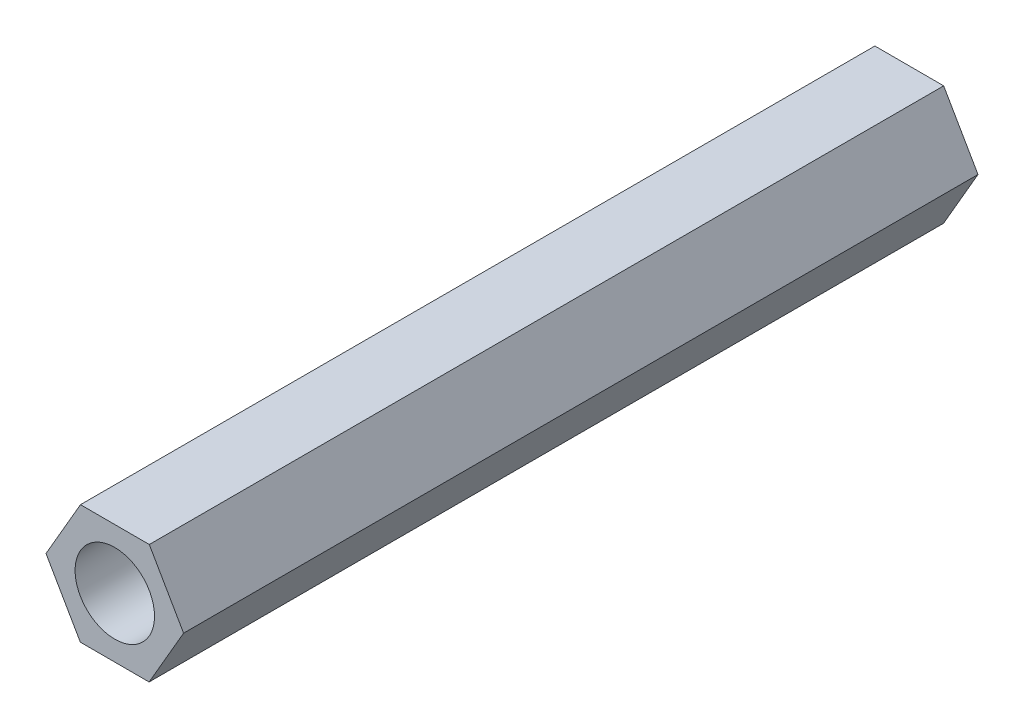
ISO-10303-21;
HEADER;
FILE_DESCRIPTION(('STEP AP214'),'2;1');
FILE_NAME('part.step','',(''),(''),'','','');
FILE_SCHEMA(('AUTOMOTIVE_DESIGN { 1 0 10303 214 1 1 1 1 }'));
ENDSEC;
DATA;
#1=APPLICATION_CONTEXT('core data for automotive mechanical design processes');
#2=APPLICATION_PROTOCOL_DEFINITION('international standard','automotive_design',2000,#1);
#3=PRODUCT_CONTEXT('',#1,'mechanical');
#4=PRODUCT('Part','Part','',(#3));
#5=PRODUCT_RELATED_PRODUCT_CATEGORY('part','',(#4));
#6=PRODUCT_DEFINITION_FORMATION('','',#4);
#7=PRODUCT_DEFINITION_CONTEXT('part definition',#1,'design');
#8=PRODUCT_DEFINITION('design','',#6,#7);
#9=PRODUCT_DEFINITION_SHAPE('','',#8);
#10=(LENGTH_UNIT() NAMED_UNIT(*) SI_UNIT(.MILLI.,.METRE.));
#11=(NAMED_UNIT(*) PLANE_ANGLE_UNIT() SI_UNIT($,.RADIAN.));
#12=(NAMED_UNIT(*) SI_UNIT($,.STERADIAN.) SOLID_ANGLE_UNIT());
#13=UNCERTAINTY_MEASURE_WITH_UNIT(LENGTH_MEASURE(1.E-05),#10,'distance_accuracy_value','');
#14=(GEOMETRIC_REPRESENTATION_CONTEXT(3) GLOBAL_UNCERTAINTY_ASSIGNED_CONTEXT((#13)) GLOBAL_UNIT_ASSIGNED_CONTEXT((#10,
#11,#12)) REPRESENTATION_CONTEXT('',''));
#15=CARTESIAN_POINT('',(0.,0.,0.));
#16=DIRECTION('',(0.,0.,1.));
#17=DIRECTION('',(1.,0.,0.));
#18=AXIS2_PLACEMENT_3D('',#15,#16,#17);
#19=CARTESIAN_POINT('',(2.60019629669739,1.49632189673249,40.));
#20=DIRECTION('',(-0.866732098899132,-0.498773965577499,0.));
#21=DIRECTION('',(0.498773965577499,-0.866732098899132,0.));
#22=AXIS2_PLACEMENT_3D('',#19,#20,#21);
#23=PLANE('',#22);
#24=DIRECTION('',(-0.498773965577499,0.866732098899132,0.));
#25=VECTOR('',#24,1.);
#26=CARTESIAN_POINT('',(2.60019629669739,1.49632189673249,0.));
#27=LINE('',#26,#25);
#28=CARTESIAN_POINT('',(3.46409814657022,-0.00490213511161112,0.));
#29=VERTEX_POINT('',#28);
#30=CARTESIAN_POINT('',(1.73629444682455,2.9975459285766,0.));
#31=VERTEX_POINT('',#30);
#32=EDGE_CURVE('E126',#29,#31,#27,.T.);
#33=ORIENTED_EDGE('',*,*,#32,.T.);
#34=DIRECTION('',(0.,0.,-1.));
#35=VECTOR('',#34,1.);
#36=CARTESIAN_POINT('',(1.73629444682455,2.9975459285766,40.));
#37=LINE('',#36,#35);
#38=CARTESIAN_POINT('',(1.73629444682455,2.9975459285766,40.));
#39=VERTEX_POINT('',#38);
#40=EDGE_CURVE('E11',#39,#31,#37,.T.);
#41=ORIENTED_EDGE('',*,*,#40,.F.);
#42=DIRECTION('',(-0.498773965577499,0.866732098899132,0.));
#43=VECTOR('',#42,1.);
#44=CARTESIAN_POINT('',(2.60019629669739,1.49632189673249,40.));
#45=LINE('',#44,#43);
#46=CARTESIAN_POINT('',(3.46409814657022,-0.00490213511161112,40.));
#47=VERTEX_POINT('',#46);
#48=EDGE_CURVE('E149',#47,#39,#45,.T.);
#49=ORIENTED_EDGE('',*,*,#48,.F.);
#50=DIRECTION('',(0.,0.,-1.));
#51=VECTOR('',#50,1.);
#52=CARTESIAN_POINT('',(3.46409814657022,-0.00490213511161112,40.));
#53=LINE('',#52,#51);
#54=EDGE_CURVE('E119',#47,#29,#53,.T.);
#55=ORIENTED_EDGE('',*,*,#54,.T.);
#56=EDGE_LOOP('',(#33,#41,#49,#55));
#57=FACE_BOUND('',#56,.T.);
#58=ADVANCED_FACE('F38',(#57),#23,.F.);
#59=CARTESIAN_POINT('',(0.00424537353943984,2.9999969961324,40.));
#60=DIRECTION('',(-0.00141512451314662,-0.999998998710805,0.));
#61=DIRECTION('',(0.999998998710805,-0.00141512451314662,0.));
#62=AXIS2_PLACEMENT_3D('',#59,#60,#61);
#63=PLANE('',#62);
#64=DIRECTION('',(-0.999998998710805,0.00141512451314662,0.));
#65=VECTOR('',#64,1.);
#66=CARTESIAN_POINT('',(0.00424537353943984,2.9999969961324,0.));
#67=LINE('',#66,#65);
#68=CARTESIAN_POINT('',(-1.72780369974567,3.00244806368821,0.));
#69=VERTEX_POINT('',#68);
#70=EDGE_CURVE('E129',#31,#69,#67,.T.);
#71=ORIENTED_EDGE('',*,*,#70,.T.);
#72=DIRECTION('',(0.,0.,-1.));
#73=VECTOR('',#72,1.);
#74=CARTESIAN_POINT('',(-1.72780369974567,3.00244806368821,40.));
#75=LINE('',#74,#73);
#76=CARTESIAN_POINT('',(-1.72780369974567,3.00244806368821,40.));
#77=VERTEX_POINT('',#76);
#78=EDGE_CURVE('E47',#77,#69,#75,.T.);
#79=ORIENTED_EDGE('',*,*,#78,.F.);
#80=DIRECTION('',(-0.999998998710805,0.00141512451314662,0.));
#81=VECTOR('',#80,1.);
#82=CARTESIAN_POINT('',(0.00424537353943984,2.9999969961324,40.));
#83=LINE('',#82,#81);
#84=EDGE_CURVE('E92',#39,#77,#83,.T.);
#85=ORIENTED_EDGE('',*,*,#84,.F.);
#86=ORIENTED_EDGE('',*,*,#40,.T.);
#87=EDGE_LOOP('',(#71,#79,#85,#86));
#88=FACE_BOUND('',#87,.T.);
#89=ADVANCED_FACE('F163',(#88),#63,.F.);
#90=CARTESIAN_POINT('',(-2.59595092315795,1.50367509939991,40.));
#91=DIRECTION('',(0.865316974385986,-0.501225033133305,0.));
#92=DIRECTION('',(0.501225033133305,0.865316974385986,0.));
#93=AXIS2_PLACEMENT_3D('',#90,#91,#92);
#94=PLANE('',#93);
#95=DIRECTION('',(-0.501225033133305,-0.865316974385986,0.));
#96=VECTOR('',#95,1.);
#97=CARTESIAN_POINT('',(-2.59595092315795,1.50367509939991,0.));
#98=LINE('',#97,#96);
#99=CARTESIAN_POINT('',(-3.46409814657022,0.00490213511161286,0.));
#100=VERTEX_POINT('',#99);
#101=EDGE_CURVE('E131',#69,#100,#98,.T.);
#102=ORIENTED_EDGE('',*,*,#101,.T.);
#103=DIRECTION('',(0.,0.,-1.));
#104=VECTOR('',#103,1.);
#105=CARTESIAN_POINT('',(-3.46409814657022,0.00490213511161286,40.));
#106=LINE('',#105,#104);
#107=CARTESIAN_POINT('',(-3.46409814657022,0.00490213511161286,40.));
#108=VERTEX_POINT('',#107);
#109=EDGE_CURVE('E114',#108,#100,#106,.T.);
#110=ORIENTED_EDGE('',*,*,#109,.F.);
#111=DIRECTION('',(-0.501225033133305,-0.865316974385986,0.));
#112=VECTOR('',#111,1.);
#113=CARTESIAN_POINT('',(-2.59595092315795,1.50367509939991,40.));
#114=LINE('',#113,#112);
#115=EDGE_CURVE('E105',#77,#108,#114,.T.);
#116=ORIENTED_EDGE('',*,*,#115,.F.);
#117=ORIENTED_EDGE('',*,*,#78,.T.);
#118=EDGE_LOOP('',(#102,#110,#116,#117));
#119=FACE_BOUND('',#118,.T.);
#120=ADVANCED_FACE('F142',(#119),#94,.F.);
#121=CARTESIAN_POINT('',(-2.60019629669739,-1.49632189673249,40.));
#122=DIRECTION('',(0.866732098899133,0.498773965577499,0.));
#123=DIRECTION('',(-0.498773965577499,0.866732098899133,0.));
#124=AXIS2_PLACEMENT_3D('',#121,#122,#123);
#125=PLANE('',#124);
#126=DIRECTION('',(0.498773965577499,-0.866732098899133,0.));
#127=VECTOR('',#126,1.);
#128=CARTESIAN_POINT('',(-2.60019629669739,-1.49632189673249,0.));
#129=LINE('',#128,#127);
#130=CARTESIAN_POINT('',(-1.73629444682455,-2.9975459285766,0.));
#131=VERTEX_POINT('',#130);
#132=EDGE_CURVE('E113',#100,#131,#129,.T.);
#133=ORIENTED_EDGE('',*,*,#132,.T.);
#134=DIRECTION('',(0.,0.,-1.));
#135=VECTOR('',#134,1.);
#136=CARTESIAN_POINT('',(-1.73629444682455,-2.9975459285766,40.));
#137=LINE('',#136,#135);
#138=CARTESIAN_POINT('',(-1.73629444682455,-2.9975459285766,40.));
#139=VERTEX_POINT('',#138);
#140=EDGE_CURVE('E110',#139,#131,#137,.T.);
#141=ORIENTED_EDGE('',*,*,#140,.F.);
#142=DIRECTION('',(0.498773965577499,-0.866732098899133,0.));
#143=VECTOR('',#142,1.);
#144=CARTESIAN_POINT('',(-2.60019629669739,-1.49632189673249,40.));
#145=LINE('',#144,#143);
#146=EDGE_CURVE('E99',#108,#139,#145,.T.);
#147=ORIENTED_EDGE('',*,*,#146,.F.);
#148=ORIENTED_EDGE('',*,*,#109,.T.);
#149=EDGE_LOOP('',(#133,#141,#147,#148));
#150=FACE_BOUND('',#149,.T.);
#151=ADVANCED_FACE('F111',(#150),#125,.F.);
#152=CARTESIAN_POINT('',(-0.00424537353944021,-2.9999969961324,40.));
#153=DIRECTION('',(0.00141512451314674,0.999998998710805,0.));
#154=DIRECTION('',(-0.999998998710805,0.00141512451314674,0.));
#155=AXIS2_PLACEMENT_3D('',#152,#153,#154);
#156=PLANE('',#155);
#157=DIRECTION('',(0.999998998710805,-0.00141512451314674,0.));
#158=VECTOR('',#157,1.);
#159=CARTESIAN_POINT('',(-0.00424537353944021,-2.9999969961324,0.));
#160=LINE('',#159,#158);
#161=CARTESIAN_POINT('',(1.72780369974567,-3.00244806368821,0.));
#162=VERTEX_POINT('',#161);
#163=EDGE_CURVE('E78',#131,#162,#160,.T.);
#164=ORIENTED_EDGE('',*,*,#163,.T.);
#165=DIRECTION('',(0.,0.,-1.));
#166=VECTOR('',#165,1.);
#167=CARTESIAN_POINT('',(1.72780369974567,-3.00244806368821,40.));
#168=LINE('',#167,#166);
#169=CARTESIAN_POINT('',(1.72780369974567,-3.00244806368821,40.));
#170=VERTEX_POINT('',#169);
#171=EDGE_CURVE('E115',#170,#162,#168,.T.);
#172=ORIENTED_EDGE('',*,*,#171,.F.);
#173=DIRECTION('',(0.999998998710805,-0.00141512451314674,0.));
#174=VECTOR('',#173,1.);
#175=CARTESIAN_POINT('',(-0.00424537353944021,-2.9999969961324,40.));
#176=LINE('',#175,#174);
#177=EDGE_CURVE('E103',#139,#170,#176,.T.);
#178=ORIENTED_EDGE('',*,*,#177,.F.);
#179=ORIENTED_EDGE('',*,*,#140,.T.);
#180=EDGE_LOOP('',(#164,#172,#178,#179));
#181=FACE_BOUND('',#180,.T.);
#182=ADVANCED_FACE('F117',(#181),#156,.F.);
#183=CARTESIAN_POINT('',(0.,0.,40.));
#184=DIRECTION('',(0.,0.,-1.));
#185=DIRECTION('',(-1.,0.,0.));
#186=AXIS2_PLACEMENT_3D('',#183,#184,#185);
#187=CYLINDRICAL_SURFACE('',#186,2.);
#188=CARTESIAN_POINT('',(0.,0.,40.));
#189=DIRECTION('',(0.,0.,1.));
#190=DIRECTION('',(1.,0.,0.));
#191=AXIS2_PLACEMENT_3D('',#188,#189,#190);
#192=CIRCLE('',#191,2.);
#193=CARTESIAN_POINT('',(2.,0.,40.));
#194=VERTEX_POINT('',#193);
#195=EDGE_CURVE('E136',#194,#194,#192,.T.);
#196=ORIENTED_EDGE('',*,*,#195,.T.);
#197=EDGE_LOOP('',(#196));
#198=FACE_BOUND('',#197,.T.);
#199=CARTESIAN_POINT('',(0.,0.,0.));
#200=DIRECTION('',(0.,0.,1.));
#201=DIRECTION('',(1.,0.,0.));
#202=AXIS2_PLACEMENT_3D('',#199,#200,#201);
#203=CIRCLE('',#202,2.);
#204=CARTESIAN_POINT('',(2.,0.,0.));
#205=VERTEX_POINT('',#204);
#206=EDGE_CURVE('E123',#205,#205,#203,.T.);
#207=ORIENTED_EDGE('',*,*,#206,.F.);
#208=EDGE_LOOP('',(#207));
#209=FACE_BOUND('',#208,.T.);
#210=ADVANCED_FACE('F40',(#198,#209),#187,.F.);
#211=CARTESIAN_POINT('',(2.59595092315795,-1.50367509939991,40.));
#212=DIRECTION('',(-0.865316974385986,0.501225033133305,0.));
#213=DIRECTION('',(-0.501225033133305,-0.865316974385986,0.));
#214=AXIS2_PLACEMENT_3D('',#211,#212,#213);
#215=PLANE('',#214);
#216=DIRECTION('',(0.501225033133305,0.865316974385986,0.));
#217=VECTOR('',#216,1.);
#218=CARTESIAN_POINT('',(2.59595092315795,-1.50367509939991,0.));
#219=LINE('',#218,#217);
#220=EDGE_CURVE('E84',#162,#29,#219,.T.);
#221=ORIENTED_EDGE('',*,*,#220,.T.);
#222=ORIENTED_EDGE('',*,*,#54,.F.);
#223=DIRECTION('',(0.501225033133305,0.865316974385986,0.));
#224=VECTOR('',#223,1.);
#225=CARTESIAN_POINT('',(2.59595092315795,-1.50367509939991,40.));
#226=LINE('',#225,#224);
#227=EDGE_CURVE('E55',#170,#47,#226,.T.);
#228=ORIENTED_EDGE('',*,*,#227,.F.);
#229=ORIENTED_EDGE('',*,*,#171,.T.);
#230=EDGE_LOOP('',(#221,#222,#228,#229));
#231=FACE_BOUND('',#230,.T.);
#232=ADVANCED_FACE('F150',(#231),#215,.F.);
#233=CARTESIAN_POINT('',(0.,0.,40.));
#234=DIRECTION('',(0.,0.,1.));
#235=DIRECTION('',(1.,0.,0.));
#236=AXIS2_PLACEMENT_3D('',#233,#234,#235);
#237=PLANE('',#236);
#238=ORIENTED_EDGE('',*,*,#195,.F.);
#239=EDGE_LOOP('',(#238));
#240=FACE_BOUND('',#239,.T.);
#241=ORIENTED_EDGE('',*,*,#48,.T.);
#242=ORIENTED_EDGE('',*,*,#84,.T.);
#243=ORIENTED_EDGE('',*,*,#115,.T.);
#244=ORIENTED_EDGE('',*,*,#146,.T.);
#245=ORIENTED_EDGE('',*,*,#177,.T.);
#246=ORIENTED_EDGE('',*,*,#227,.T.);
#247=EDGE_LOOP('',(#241,#242,#243,#244,#245,#246));
#248=FACE_BOUND('',#247,.T.);
#249=ADVANCED_FACE('F101',(#240,#248),#237,.T.);
#250=CARTESIAN_POINT('',(0.,0.,0.));
#251=DIRECTION('',(0.,0.,1.));
#252=DIRECTION('',(1.,0.,0.));
#253=AXIS2_PLACEMENT_3D('',#250,#251,#252);
#254=PLANE('',#253);
#255=ORIENTED_EDGE('',*,*,#206,.T.);
#256=EDGE_LOOP('',(#255));
#257=FACE_BOUND('',#256,.T.);
#258=ORIENTED_EDGE('',*,*,#32,.F.);
#259=ORIENTED_EDGE('',*,*,#220,.F.);
#260=ORIENTED_EDGE('',*,*,#163,.F.);
#261=ORIENTED_EDGE('',*,*,#132,.F.);
#262=ORIENTED_EDGE('',*,*,#101,.F.);
#263=ORIENTED_EDGE('',*,*,#70,.F.);
#264=EDGE_LOOP('',(#258,#259,#260,#261,#262,#263));
#265=FACE_BOUND('',#264,.T.);
#266=ADVANCED_FACE('F145',(#257,#265),#254,.F.);
#267=CLOSED_SHELL('',(#58,#89,#120,#151,#182,#210,#232,#249,#266));
#268=MANIFOLD_SOLID_BREP('B2',#267);
#269=ADVANCED_BREP_SHAPE_REPRESENTATION('',(#18,#268),#14);
#270=SHAPE_DEFINITION_REPRESENTATION(#9,#269);
ENDSEC;
END-ISO-10303-21;
